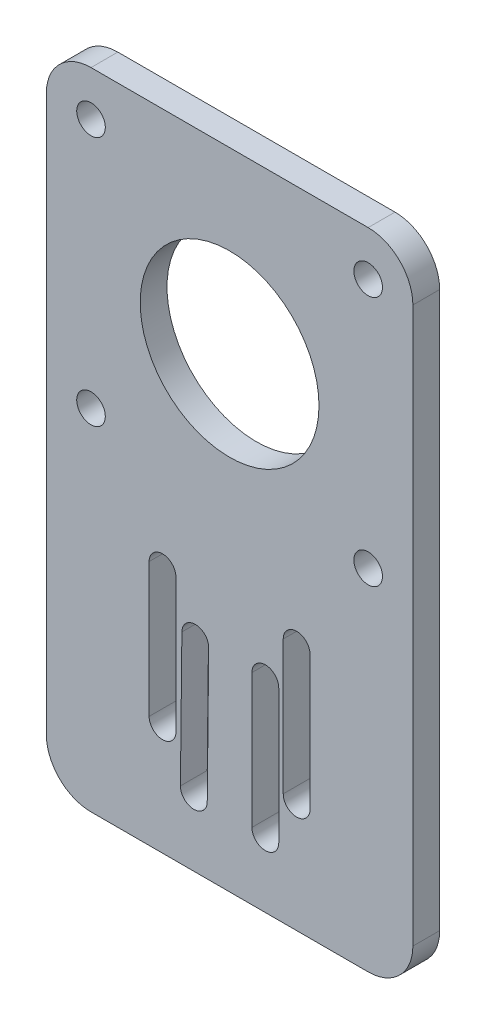
ISO-10303-21;
HEADER;
FILE_DESCRIPTION(('STEP AP214'),'2;1');
FILE_NAME('part.step','',(''),(''),'','','');
FILE_SCHEMA(('AUTOMOTIVE_DESIGN { 1 0 10303 214 1 1 1 1 }'));
ENDSEC;
DATA;
#1=APPLICATION_CONTEXT('core data for automotive mechanical design processes');
#2=APPLICATION_PROTOCOL_DEFINITION('international standard','automotive_design',2000,#1);
#3=PRODUCT_CONTEXT('',#1,'mechanical');
#4=PRODUCT('Part','Part','',(#3));
#5=PRODUCT_RELATED_PRODUCT_CATEGORY('part','',(#4));
#6=PRODUCT_DEFINITION_FORMATION('','',#4);
#7=PRODUCT_DEFINITION_CONTEXT('part definition',#1,'design');
#8=PRODUCT_DEFINITION('design','',#6,#7);
#9=PRODUCT_DEFINITION_SHAPE('','',#8);
#10=(LENGTH_UNIT() NAMED_UNIT(*) SI_UNIT(.MILLI.,.METRE.));
#11=(NAMED_UNIT(*) PLANE_ANGLE_UNIT() SI_UNIT($,.RADIAN.));
#12=(NAMED_UNIT(*) SI_UNIT($,.STERADIAN.) SOLID_ANGLE_UNIT());
#13=UNCERTAINTY_MEASURE_WITH_UNIT(LENGTH_MEASURE(1.E-05),#10,'distance_accuracy_value','');
#14=(GEOMETRIC_REPRESENTATION_CONTEXT(3) GLOBAL_UNCERTAINTY_ASSIGNED_CONTEXT((#13)) GLOBAL_UNIT_ASSIGNED_CONTEXT((#10,
#11,#12)) REPRESENTATION_CONTEXT('',''));
#15=CARTESIAN_POINT('',(0.,0.,0.));
#16=DIRECTION('',(0.,0.,1.));
#17=DIRECTION('',(1.,0.,0.));
#18=AXIS2_PLACEMENT_3D('',#15,#16,#17);
#19=CARTESIAN_POINT('',(559.100046396,830.,380.));
#20=DIRECTION('',(-1.,0.,0.));
#21=DIRECTION('',(0.,0.,1.));
#22=AXIS2_PLACEMENT_3D('',#19,#20,#21);
#23=PLANE('',#22);
#24=DIRECTION('',(0.,-1.,0.));
#25=VECTOR('',#24,1.);
#26=CARTESIAN_POINT('',(559.100046396,793.950476655,383.));
#27=LINE('',#26,#25);
#28=CARTESIAN_POINT('',(559.100046396,825.,383.));
#29=VERTEX_POINT('',#28);
#30=CARTESIAN_POINT('',(559.100046396,762.900953309,383.));
#31=VERTEX_POINT('',#30);
#32=EDGE_CURVE('E347',#29,#31,#27,.T.);
#33=ORIENTED_EDGE('',*,*,#32,.F.);
#34=DIRECTION('',(0.,0.,1.));
#35=VECTOR('',#34,1.);
#36=CARTESIAN_POINT('',(559.100046396,825.,381.5));
#37=LINE('',#36,#35);
#38=CARTESIAN_POINT('',(559.100046396,825.,380.));
#39=VERTEX_POINT('',#38);
#40=EDGE_CURVE('E296',#39,#29,#37,.T.);
#41=ORIENTED_EDGE('',*,*,#40,.F.);
#42=DIRECTION('',(0.,-1.,0.));
#43=VECTOR('',#42,1.);
#44=CARTESIAN_POINT('',(559.100046396,793.950476655,380.));
#45=LINE('',#44,#43);
#46=CARTESIAN_POINT('',(559.100046396,762.900953309,380.));
#47=VERTEX_POINT('',#46);
#48=EDGE_CURVE('E360',#39,#47,#45,.T.);
#49=ORIENTED_EDGE('',*,*,#48,.T.);
#50=DIRECTION('',(0.,0.,1.));
#51=VECTOR('',#50,1.);
#52=CARTESIAN_POINT('',(559.100046396,762.900953309,381.5));
#53=LINE('',#52,#51);
#54=EDGE_CURVE('E10',#47,#31,#53,.T.);
#55=ORIENTED_EDGE('',*,*,#54,.T.);
#56=EDGE_LOOP('',(#33,#41,#49,#55));
#57=FACE_BOUND('',#56,.T.);
#58=ADVANCED_FACE('F16',(#57),#23,.T.);
#59=CARTESIAN_POINT('',(564.100046396,762.900953309,381.5));
#60=DIRECTION('',(0.,0.,1.));
#61=DIRECTION('',(-1.,0.,0.));
#62=AXIS2_PLACEMENT_3D('',#59,#60,#61);
#63=CYLINDRICAL_SURFACE('',#62,5.);
#64=CARTESIAN_POINT('',(564.100046396,762.900953309,383.));
#65=DIRECTION('',(0.,0.,-1.));
#66=DIRECTION('',(1.,0.,0.));
#67=AXIS2_PLACEMENT_3D('',#64,#65,#66);
#68=CIRCLE('',#67,5.);
#69=CARTESIAN_POINT('',(564.100046396,757.900953309,383.));
#70=VERTEX_POINT('',#69);
#71=EDGE_CURVE('E334',#70,#31,#68,.T.);
#72=ORIENTED_EDGE('',*,*,#71,.T.);
#73=ORIENTED_EDGE('',*,*,#54,.F.);
#74=CARTESIAN_POINT('',(564.100046396,762.900953309,380.));
#75=DIRECTION('',(0.,0.,1.));
#76=DIRECTION('',(1.,0.,0.));
#77=AXIS2_PLACEMENT_3D('',#74,#75,#76);
#78=CIRCLE('',#77,5.);
#79=CARTESIAN_POINT('',(564.100046396,757.900953309,380.));
#80=VERTEX_POINT('',#79);
#81=EDGE_CURVE('E365',#47,#80,#78,.T.);
#82=ORIENTED_EDGE('',*,*,#81,.T.);
#83=DIRECTION('',(0.,0.,1.));
#84=VECTOR('',#83,1.);
#85=CARTESIAN_POINT('',(564.100046396,757.900953309,381.5));
#86=LINE('',#85,#84);
#87=EDGE_CURVE('E25',#80,#70,#86,.T.);
#88=ORIENTED_EDGE('',*,*,#87,.T.);
#89=EDGE_LOOP('',(#72,#73,#82,#88));
#90=FACE_BOUND('',#89,.T.);
#91=ADVANCED_FACE('F598',(#90),#63,.T.);
#92=CARTESIAN_POINT('',(600.100046396,757.900953309,380.));
#93=DIRECTION('',(0.,1.,0.));
#94=DIRECTION('',(0.,0.,-1.));
#95=AXIS2_PLACEMENT_3D('',#92,#93,#94);
#96=PLANE('',#95);
#97=ORIENTED_EDGE('',*,*,#87,.F.);
#98=DIRECTION('',(1.,0.,0.));
#99=VECTOR('',#98,1.);
#100=CARTESIAN_POINT('',(579.600046396,757.900953309,380.));
#101=LINE('',#100,#99);
#102=CARTESIAN_POINT('',(595.100046396,757.900953309,380.));
#103=VERTEX_POINT('',#102);
#104=EDGE_CURVE('E246',#80,#103,#101,.T.);
#105=ORIENTED_EDGE('',*,*,#104,.T.);
#106=DIRECTION('',(0.,0.,1.));
#107=VECTOR('',#106,1.);
#108=CARTESIAN_POINT('',(595.100046396,757.900953309,381.5));
#109=LINE('',#108,#107);
#110=CARTESIAN_POINT('',(595.100046396,757.900953309,383.));
#111=VERTEX_POINT('',#110);
#112=EDGE_CURVE('E19',#103,#111,#109,.T.);
#113=ORIENTED_EDGE('',*,*,#112,.T.);
#114=DIRECTION('',(1.,0.,0.));
#115=VECTOR('',#114,1.);
#116=CARTESIAN_POINT('',(579.600046396,757.900953309,383.));
#117=LINE('',#116,#115);
#118=EDGE_CURVE('E185',#70,#111,#117,.T.);
#119=ORIENTED_EDGE('',*,*,#118,.F.);
#120=EDGE_LOOP('',(#97,#105,#113,#119));
#121=FACE_BOUND('',#120,.T.);
#122=ADVANCED_FACE('F602',(#121),#96,.F.);
#123=CARTESIAN_POINT('',(595.100046396,762.900953309,381.5));
#124=DIRECTION('',(0.,0.,1.));
#125=DIRECTION('',(0.,-1.,0.));
#126=AXIS2_PLACEMENT_3D('',#123,#124,#125);
#127=CYLINDRICAL_SURFACE('',#126,5.);
#128=CARTESIAN_POINT('',(595.100046396,762.900953309,383.));
#129=DIRECTION('',(0.,0.,-1.));
#130=DIRECTION('',(1.,0.,0.));
#131=AXIS2_PLACEMENT_3D('',#128,#129,#130);
#132=CIRCLE('',#131,5.);
#133=CARTESIAN_POINT('',(600.100046396,762.900953309,383.));
#134=VERTEX_POINT('',#133);
#135=EDGE_CURVE('E328',#134,#111,#132,.T.);
#136=ORIENTED_EDGE('',*,*,#135,.T.);
#137=ORIENTED_EDGE('',*,*,#112,.F.);
#138=CARTESIAN_POINT('',(595.100046396,762.900953309,380.));
#139=DIRECTION('',(0.,0.,1.));
#140=DIRECTION('',(1.,0.,0.));
#141=AXIS2_PLACEMENT_3D('',#138,#139,#140);
#142=CIRCLE('',#141,5.);
#143=CARTESIAN_POINT('',(600.100046396,762.900953309,380.));
#144=VERTEX_POINT('',#143);
#145=EDGE_CURVE('E250',#103,#144,#142,.T.);
#146=ORIENTED_EDGE('',*,*,#145,.T.);
#147=DIRECTION('',(0.,0.,1.));
#148=VECTOR('',#147,1.);
#149=CARTESIAN_POINT('',(600.100046396,762.900953309,381.5));
#150=LINE('',#149,#148);
#151=EDGE_CURVE('E50',#144,#134,#150,.T.);
#152=ORIENTED_EDGE('',*,*,#151,.T.);
#153=EDGE_LOOP('',(#136,#137,#146,#152));
#154=FACE_BOUND('',#153,.T.);
#155=ADVANCED_FACE('F607',(#154),#127,.T.);
#156=CARTESIAN_POINT('',(600.100046396,757.900953309,380.));
#157=DIRECTION('',(1.,0.,0.));
#158=DIRECTION('',(0.,0.,1.));
#159=AXIS2_PLACEMENT_3D('',#156,#157,#158);
#160=PLANE('',#159);
#161=DIRECTION('',(0.,1.,0.));
#162=VECTOR('',#161,1.);
#163=CARTESIAN_POINT('',(600.100046396,793.950476655,383.));
#164=LINE('',#163,#162);
#165=CARTESIAN_POINT('',(600.100046396,825.,383.));
#166=VERTEX_POINT('',#165);
#167=EDGE_CURVE('E337',#134,#166,#164,.T.);
#168=ORIENTED_EDGE('',*,*,#167,.F.);
#169=ORIENTED_EDGE('',*,*,#151,.F.);
#170=DIRECTION('',(0.,1.,0.));
#171=VECTOR('',#170,1.);
#172=CARTESIAN_POINT('',(600.100046396,793.950476655,380.));
#173=LINE('',#172,#171);
#174=CARTESIAN_POINT('',(600.100046396,825.,380.));
#175=VERTEX_POINT('',#174);
#176=EDGE_CURVE('E303',#144,#175,#173,.T.);
#177=ORIENTED_EDGE('',*,*,#176,.T.);
#178=DIRECTION('',(0.,0.,1.));
#179=VECTOR('',#178,1.);
#180=CARTESIAN_POINT('',(600.100046396,825.,381.5));
#181=LINE('',#180,#179);
#182=EDGE_CURVE('E293',#175,#166,#181,.T.);
#183=ORIENTED_EDGE('',*,*,#182,.T.);
#184=EDGE_LOOP('',(#168,#169,#177,#183));
#185=FACE_BOUND('',#184,.T.);
#186=ADVANCED_FACE('F613',(#185),#160,.T.);
#187=CARTESIAN_POINT('',(564.100046396,825.,381.5));
#188=DIRECTION('',(0.,0.,1.));
#189=DIRECTION('',(0.,1.,0.));
#190=AXIS2_PLACEMENT_3D('',#187,#188,#189);
#191=CYLINDRICAL_SURFACE('',#190,5.);
#192=CARTESIAN_POINT('',(564.100046396,825.,383.));
#193=DIRECTION('',(0.,0.,-1.));
#194=DIRECTION('',(1.,0.,0.));
#195=AXIS2_PLACEMENT_3D('',#192,#193,#194);
#196=CIRCLE('',#195,5.);
#197=CARTESIAN_POINT('',(564.100046396,830.,383.));
#198=VERTEX_POINT('',#197);
#199=EDGE_CURVE('E259',#29,#198,#196,.T.);
#200=ORIENTED_EDGE('',*,*,#199,.T.);
#201=DIRECTION('',(0.,0.,1.));
#202=VECTOR('',#201,1.);
#203=CARTESIAN_POINT('',(564.100046396,830.,381.5));
#204=LINE('',#203,#202);
#205=CARTESIAN_POINT('',(564.100046396,830.,380.));
#206=VERTEX_POINT('',#205);
#207=EDGE_CURVE('E120',#206,#198,#204,.T.);
#208=ORIENTED_EDGE('',*,*,#207,.F.);
#209=CARTESIAN_POINT('',(564.100046396,825.,380.));
#210=DIRECTION('',(0.,0.,1.));
#211=DIRECTION('',(1.,0.,0.));
#212=AXIS2_PLACEMENT_3D('',#209,#210,#211);
#213=CIRCLE('',#212,5.);
#214=EDGE_CURVE('E356',#206,#39,#213,.T.);
#215=ORIENTED_EDGE('',*,*,#214,.T.);
#216=ORIENTED_EDGE('',*,*,#40,.T.);
#217=EDGE_LOOP('',(#200,#208,#215,#216));
#218=FACE_BOUND('',#217,.T.);
#219=ADVANCED_FACE('F403',(#218),#191,.T.);
#220=CARTESIAN_POINT('',(595.100046396,825.,381.5));
#221=DIRECTION('',(0.,0.,1.));
#222=DIRECTION('',(1.,0.,0.));
#223=AXIS2_PLACEMENT_3D('',#220,#221,#222);
#224=CYLINDRICAL_SURFACE('',#223,5.);
#225=CARTESIAN_POINT('',(595.100046396,825.,383.));
#226=DIRECTION('',(0.,0.,-1.));
#227=DIRECTION('',(1.,0.,0.));
#228=AXIS2_PLACEMENT_3D('',#225,#226,#227);
#229=CIRCLE('',#228,5.);
#230=CARTESIAN_POINT('',(595.100046396,830.,383.));
#231=VERTEX_POINT('',#230);
#232=EDGE_CURVE('E260',#231,#166,#229,.T.);
#233=ORIENTED_EDGE('',*,*,#232,.T.);
#234=ORIENTED_EDGE('',*,*,#182,.F.);
#235=CARTESIAN_POINT('',(595.100046396,825.,380.));
#236=DIRECTION('',(0.,0.,1.));
#237=DIRECTION('',(1.,0.,0.));
#238=AXIS2_PLACEMENT_3D('',#235,#236,#237);
#239=CIRCLE('',#238,5.);
#240=CARTESIAN_POINT('',(595.100046396,830.,380.));
#241=VERTEX_POINT('',#240);
#242=EDGE_CURVE('E372',#175,#241,#239,.T.);
#243=ORIENTED_EDGE('',*,*,#242,.T.);
#244=DIRECTION('',(0.,0.,1.));
#245=VECTOR('',#244,1.);
#246=CARTESIAN_POINT('',(595.100046396,830.,381.5));
#247=LINE('',#246,#245);
#248=EDGE_CURVE('E109',#241,#231,#247,.T.);
#249=ORIENTED_EDGE('',*,*,#248,.T.);
#250=EDGE_LOOP('',(#233,#234,#243,#249));
#251=FACE_BOUND('',#250,.T.);
#252=ADVANCED_FACE('F620',(#251),#224,.T.);
#253=CARTESIAN_POINT('',(559.100046396,830.,380.));
#254=DIRECTION('',(0.,-1.,0.));
#255=DIRECTION('',(0.,0.,-1.));
#256=AXIS2_PLACEMENT_3D('',#253,#254,#255);
#257=PLANE('',#256);
#258=ORIENTED_EDGE('',*,*,#207,.T.);
#259=DIRECTION('',(-1.,0.,0.));
#260=VECTOR('',#259,1.);
#261=CARTESIAN_POINT('',(579.600046396,830.,383.));
#262=LINE('',#261,#260);
#263=EDGE_CURVE('E255',#231,#198,#262,.T.);
#264=ORIENTED_EDGE('',*,*,#263,.F.);
#265=ORIENTED_EDGE('',*,*,#248,.F.);
#266=DIRECTION('',(-1.,0.,0.));
#267=VECTOR('',#266,1.);
#268=CARTESIAN_POINT('',(579.600046396,830.,380.));
#269=LINE('',#268,#267);
#270=EDGE_CURVE('E359',#241,#206,#269,.T.);
#271=ORIENTED_EDGE('',*,*,#270,.T.);
#272=EDGE_LOOP('',(#258,#264,#265,#271));
#273=FACE_BOUND('',#272,.T.);
#274=ADVANCED_FACE('F616',(#273),#257,.F.);
#275=CARTESIAN_POINT('',(579.600046396,810.,381.5));
#276=DIRECTION('',(0.,0.,1.));
#277=DIRECTION('',(1.,0.,0.));
#278=AXIS2_PLACEMENT_3D('',#275,#276,#277);
#279=CYLINDRICAL_SURFACE('',#278,10.);
#280=CARTESIAN_POINT('',(579.600046396,810.,383.));
#281=DIRECTION('',(0.,0.,1.));
#282=DIRECTION('',(1.,0.,0.));
#283=AXIS2_PLACEMENT_3D('',#280,#281,#282);
#284=CIRCLE('',#283,10.);
#285=CARTESIAN_POINT('',(589.600046396,810.,383.));
#286=VERTEX_POINT('',#285);
#287=EDGE_CURVE('E329',#286,#286,#284,.T.);
#288=ORIENTED_EDGE('',*,*,#287,.T.);
#289=EDGE_LOOP('',(#288));
#290=FACE_BOUND('',#289,.T.);
#291=CARTESIAN_POINT('',(579.600046396,810.,380.));
#292=DIRECTION('',(0.,0.,1.));
#293=DIRECTION('',(1.,0.,0.));
#294=AXIS2_PLACEMENT_3D('',#291,#292,#293);
#295=CIRCLE('',#294,10.);
#296=CARTESIAN_POINT('',(589.600046396,810.,380.));
#297=VERTEX_POINT('',#296);
#298=EDGE_CURVE('E249',#297,#297,#295,.T.);
#299=ORIENTED_EDGE('',*,*,#298,.F.);
#300=EDGE_LOOP('',(#299));
#301=FACE_BOUND('',#300,.T.);
#302=ADVANCED_FACE('F619',(#290,#301),#279,.F.);
#303=CARTESIAN_POINT('',(595.100046396,797.,381.5));
#304=DIRECTION('',(0.,0.,1.));
#305=DIRECTION('',(1.,0.,0.));
#306=AXIS2_PLACEMENT_3D('',#303,#304,#305);
#307=CYLINDRICAL_SURFACE('',#306,1.59999999987);
#308=CARTESIAN_POINT('',(595.100046396,797.,383.));
#309=DIRECTION('',(0.,0.,1.));
#310=DIRECTION('',(1.,0.,0.));
#311=AXIS2_PLACEMENT_3D('',#308,#309,#310);
#312=CIRCLE('',#311,1.59999999987);
#313=CARTESIAN_POINT('',(596.70004639587,797.,383.));
#314=VERTEX_POINT('',#313);
#315=EDGE_CURVE('E333',#314,#314,#312,.T.);
#316=ORIENTED_EDGE('',*,*,#315,.T.);
#317=EDGE_LOOP('',(#316));
#318=FACE_BOUND('',#317,.T.);
#319=CARTESIAN_POINT('',(595.100046396,797.,380.));
#320=DIRECTION('',(0.,0.,1.));
#321=DIRECTION('',(1.,0.,0.));
#322=AXIS2_PLACEMENT_3D('',#319,#320,#321);
#323=CIRCLE('',#322,1.59999999987);
#324=CARTESIAN_POINT('',(596.70004639587,797.,380.));
#325=VERTEX_POINT('',#324);
#326=EDGE_CURVE('E380',#325,#325,#323,.T.);
#327=ORIENTED_EDGE('',*,*,#326,.F.);
#328=EDGE_LOOP('',(#327));
#329=FACE_BOUND('',#328,.T.);
#330=ADVANCED_FACE('F623',(#318,#329),#307,.F.);
#331=CARTESIAN_POINT('',(564.100046396,797.,381.5));
#332=DIRECTION('',(0.,0.,1.));
#333=DIRECTION('',(1.,0.,0.));
#334=AXIS2_PLACEMENT_3D('',#331,#332,#333);
#335=CYLINDRICAL_SURFACE('',#334,1.59999999984);
#336=CARTESIAN_POINT('',(564.100046396,797.,383.));
#337=DIRECTION('',(0.,0.,1.));
#338=DIRECTION('',(1.,0.,0.));
#339=AXIS2_PLACEMENT_3D('',#336,#337,#338);
#340=CIRCLE('',#339,1.59999999984);
#341=CARTESIAN_POINT('',(565.70004639584,797.,383.));
#342=VERTEX_POINT('',#341);
#343=EDGE_CURVE('E351',#342,#342,#340,.T.);
#344=ORIENTED_EDGE('',*,*,#343,.T.);
#345=EDGE_LOOP('',(#344));
#346=FACE_BOUND('',#345,.T.);
#347=CARTESIAN_POINT('',(564.100046396,797.,380.));
#348=DIRECTION('',(0.,0.,1.));
#349=DIRECTION('',(1.,0.,0.));
#350=AXIS2_PLACEMENT_3D('',#347,#348,#349);
#351=CIRCLE('',#350,1.59999999984);
#352=CARTESIAN_POINT('',(565.70004639584,797.,380.));
#353=VERTEX_POINT('',#352);
#354=EDGE_CURVE('E384',#353,#353,#351,.T.);
#355=ORIENTED_EDGE('',*,*,#354,.F.);
#356=EDGE_LOOP('',(#355));
#357=FACE_BOUND('',#356,.T.);
#358=ADVANCED_FACE('F627',(#346,#357),#335,.F.);
#359=CARTESIAN_POINT('',(564.100046396,825.,381.5));
#360=DIRECTION('',(0.,0.,1.));
#361=DIRECTION('',(1.,0.,0.));
#362=AXIS2_PLACEMENT_3D('',#359,#360,#361);
#363=CYLINDRICAL_SURFACE('',#362,1.59999999984);
#364=CARTESIAN_POINT('',(564.100046396,825.,383.));
#365=DIRECTION('',(0.,0.,1.));
#366=DIRECTION('',(1.,0.,0.));
#367=AXIS2_PLACEMENT_3D('',#364,#365,#366);
#368=CIRCLE('',#367,1.59999999984);
#369=CARTESIAN_POINT('',(565.70004639584,825.,383.));
#370=VERTEX_POINT('',#369);
#371=EDGE_CURVE('E355',#370,#370,#368,.T.);
#372=ORIENTED_EDGE('',*,*,#371,.T.);
#373=EDGE_LOOP('',(#372));
#374=FACE_BOUND('',#373,.T.);
#375=CARTESIAN_POINT('',(564.100046396,825.,380.));
#376=DIRECTION('',(0.,0.,1.));
#377=DIRECTION('',(1.,0.,0.));
#378=AXIS2_PLACEMENT_3D('',#375,#376,#377);
#379=CIRCLE('',#378,1.59999999984);
#380=CARTESIAN_POINT('',(565.70004639584,825.,380.));
#381=VERTEX_POINT('',#380);
#382=EDGE_CURVE('E388',#381,#381,#379,.T.);
#383=ORIENTED_EDGE('',*,*,#382,.F.);
#384=EDGE_LOOP('',(#383));
#385=FACE_BOUND('',#384,.T.);
#386=ADVANCED_FACE('F631',(#374,#385),#363,.F.);
#387=CARTESIAN_POINT('',(595.100046396,825.,381.5));
#388=DIRECTION('',(0.,0.,1.));
#389=DIRECTION('',(1.,0.,0.));
#390=AXIS2_PLACEMENT_3D('',#387,#388,#389);
#391=CYLINDRICAL_SURFACE('',#390,1.59999999994);
#392=CARTESIAN_POINT('',(595.100046396,825.,383.));
#393=DIRECTION('',(0.,0.,1.));
#394=DIRECTION('',(1.,0.,0.));
#395=AXIS2_PLACEMENT_3D('',#392,#393,#394);
#396=CIRCLE('',#395,1.59999999994);
#397=CARTESIAN_POINT('',(596.70004639594,825.,383.));
#398=VERTEX_POINT('',#397);
#399=EDGE_CURVE('E361',#398,#398,#396,.T.);
#400=ORIENTED_EDGE('',*,*,#399,.T.);
#401=EDGE_LOOP('',(#400));
#402=FACE_BOUND('',#401,.T.);
#403=CARTESIAN_POINT('',(595.100046396,825.,380.));
#404=DIRECTION('',(0.,0.,1.));
#405=DIRECTION('',(1.,0.,0.));
#406=AXIS2_PLACEMENT_3D('',#403,#404,#405);
#407=CIRCLE('',#406,1.59999999994);
#408=CARTESIAN_POINT('',(596.70004639594,825.,380.));
#409=VERTEX_POINT('',#408);
#410=EDGE_CURVE('E394',#409,#409,#407,.T.);
#411=ORIENTED_EDGE('',*,*,#410,.F.);
#412=EDGE_LOOP('',(#411));
#413=FACE_BOUND('',#412,.T.);
#414=ADVANCED_FACE('F633',(#402,#413),#391,.F.);
#415=CARTESIAN_POINT('',(0.,0.,380.));
#416=DIRECTION('',(0.,0.,1.));
#417=DIRECTION('',(0.,-1.,0.));
#418=AXIS2_PLACEMENT_3D('',#415,#416,#417);
#419=PLANE('',#418);
#420=DIRECTION('',(0.,-1.,0.));
#421=VECTOR('',#420,1.);
#422=CARTESIAN_POINT('',(585.600046396,777.900953309,380.));
#423=LINE('',#422,#421);
#424=CARTESIAN_POINT('',(585.600046396,785.400953309,380.));
#425=VERTEX_POINT('',#424);
#426=CARTESIAN_POINT('',(585.600046396,770.400953309,380.));
#427=VERTEX_POINT('',#426);
#428=EDGE_CURVE('E180',#425,#427,#423,.T.);
#429=ORIENTED_EDGE('',*,*,#428,.T.);
#430=CARTESIAN_POINT('',(587.100046396,770.400953309,380.));
#431=DIRECTION('',(0.,0.,1.));
#432=DIRECTION('',(1.,0.,0.));
#433=AXIS2_PLACEMENT_3D('',#430,#431,#432);
#434=CIRCLE('',#433,1.5);
#435=CARTESIAN_POINT('',(588.600046396,770.400953309,380.));
#436=VERTEX_POINT('',#435);
#437=EDGE_CURVE('E313',#427,#436,#434,.T.);
#438=ORIENTED_EDGE('',*,*,#437,.T.);
#439=DIRECTION('',(0.,1.,0.));
#440=VECTOR('',#439,1.);
#441=CARTESIAN_POINT('',(588.600046396,777.900953309,380.));
#442=LINE('',#441,#440);
#443=CARTESIAN_POINT('',(588.600046396,785.400953309,380.));
#444=VERTEX_POINT('',#443);
#445=EDGE_CURVE('E182',#436,#444,#442,.T.);
#446=ORIENTED_EDGE('',*,*,#445,.T.);
#447=CARTESIAN_POINT('',(587.100046396,785.400953309,380.));
#448=DIRECTION('',(0.,0.,1.));
#449=DIRECTION('',(1.,0.,0.));
#450=AXIS2_PLACEMENT_3D('',#447,#448,#449);
#451=CIRCLE('',#450,1.5);
#452=EDGE_CURVE('E175',#444,#425,#451,.T.);
#453=ORIENTED_EDGE('',*,*,#452,.T.);
#454=EDGE_LOOP('',(#429,#438,#446,#453));
#455=FACE_BOUND('',#454,.T.);
#456=DIRECTION('',(0.,1.,0.));
#457=VECTOR('',#456,1.);
#458=CARTESIAN_POINT('',(585.100046396,772.900953309,380.));
#459=LINE('',#458,#457);
#460=CARTESIAN_POINT('',(585.100046396,765.400953309,380.));
#461=VERTEX_POINT('',#460);
#462=CARTESIAN_POINT('',(585.100046396,780.400953309,380.));
#463=VERTEX_POINT('',#462);
#464=EDGE_CURVE('E230',#461,#463,#459,.T.);
#465=ORIENTED_EDGE('',*,*,#464,.T.);
#466=CARTESIAN_POINT('',(583.600046396,780.400953309,380.));
#467=DIRECTION('',(0.,0.,1.));
#468=DIRECTION('',(1.,0.,0.));
#469=AXIS2_PLACEMENT_3D('',#466,#467,#468);
#470=CIRCLE('',#469,1.5);
#471=CARTESIAN_POINT('',(582.100046396,780.400953309,380.));
#472=VERTEX_POINT('',#471);
#473=EDGE_CURVE('E220',#463,#472,#470,.T.);
#474=ORIENTED_EDGE('',*,*,#473,.T.);
#475=DIRECTION('',(0.,-1.,0.));
#476=VECTOR('',#475,1.);
#477=CARTESIAN_POINT('',(582.100046396,772.900953309,380.));
#478=LINE('',#477,#476);
#479=CARTESIAN_POINT('',(582.100046396,765.400953309,380.));
#480=VERTEX_POINT('',#479);
#481=EDGE_CURVE('E292',#472,#480,#478,.T.);
#482=ORIENTED_EDGE('',*,*,#481,.T.);
#483=CARTESIAN_POINT('',(583.600046396,765.400953309,380.));
#484=DIRECTION('',(0.,0.,1.));
#485=DIRECTION('',(1.,0.,0.));
#486=AXIS2_PLACEMENT_3D('',#483,#484,#485);
#487=CIRCLE('',#486,1.5);
#488=EDGE_CURVE('E309',#480,#461,#487,.T.);
#489=ORIENTED_EDGE('',*,*,#488,.T.);
#490=EDGE_LOOP('',(#465,#474,#482,#489));
#491=FACE_BOUND('',#490,.T.);
#492=DIRECTION('',(-0.0109878593111968,-0.99993963165171,0.));
#493=VECTOR('',#492,1.);
#494=CARTESIAN_POINT('',(574.182545894,772.916982336,380.));
#495=LINE('',#494,#493);
#496=CARTESIAN_POINT('',(574.264954838,780.416529573,380.));
#497=VERTEX_POINT('',#496);
#498=CARTESIAN_POINT('',(574.100136949,765.417435098,380.));
#499=VERTEX_POINT('',#498);
#500=EDGE_CURVE('E214',#497,#499,#495,.T.);
#501=ORIENTED_EDGE('',*,*,#500,.T.);
#502=CARTESIAN_POINT('',(575.600046396,765.400953309,380.));
#503=DIRECTION('',(0.,0.,1.));
#504=DIRECTION('',(1.,0.,0.));
#505=AXIS2_PLACEMENT_3D('',#502,#503,#504);
#506=CIRCLE('',#505,1.5);
#507=CARTESIAN_POINT('',(577.099955844,765.38447152,380.));
#508=VERTEX_POINT('',#507);
#509=EDGE_CURVE('E468',#499,#508,#506,.T.);
#510=ORIENTED_EDGE('',*,*,#509,.T.);
#511=DIRECTION('',(0.0109878593111968,0.99993963165171,0.));
#512=VECTOR('',#511,1.);
#513=CARTESIAN_POINT('',(577.182364789,772.884018758,380.));
#514=LINE('',#513,#512);
#515=CARTESIAN_POINT('',(577.264773733,780.383565995,380.));
#516=VERTEX_POINT('',#515);
#517=EDGE_CURVE('E245',#508,#516,#514,.T.);
#518=ORIENTED_EDGE('',*,*,#517,.T.);
#519=CARTESIAN_POINT('',(575.764864286,780.400047784,380.));
#520=DIRECTION('',(0.,0.,1.));
#521=DIRECTION('',(1.,0.,0.));
#522=AXIS2_PLACEMENT_3D('',#519,#520,#521);
#523=CIRCLE('',#522,1.5);
#524=EDGE_CURVE('E264',#516,#497,#523,.T.);
#525=ORIENTED_EDGE('',*,*,#524,.T.);
#526=EDGE_LOOP('',(#501,#510,#518,#525));
#527=FACE_BOUND('',#526,.T.);
#528=DIRECTION('',(0.,1.,0.));
#529=VECTOR('',#528,1.);
#530=CARTESIAN_POINT('',(573.600046396,777.900953309,380.));
#531=LINE('',#530,#529);
#532=CARTESIAN_POINT('',(573.600046396,770.400953309,380.));
#533=VERTEX_POINT('',#532);
#534=CARTESIAN_POINT('',(573.600046396,785.400953309,380.));
#535=VERTEX_POINT('',#534);
#536=EDGE_CURVE('E477',#533,#535,#531,.T.);
#537=ORIENTED_EDGE('',*,*,#536,.T.);
#538=CARTESIAN_POINT('',(572.100046396,785.400953309,380.));
#539=DIRECTION('',(0.,0.,1.));
#540=DIRECTION('',(1.,0.,0.));
#541=AXIS2_PLACEMENT_3D('',#538,#539,#540);
#542=CIRCLE('',#541,1.5);
#543=CARTESIAN_POINT('',(570.600046396,785.400953309,380.));
#544=VERTEX_POINT('',#543);
#545=EDGE_CURVE('E464',#535,#544,#542,.T.);
#546=ORIENTED_EDGE('',*,*,#545,.T.);
#547=DIRECTION('',(0.,-1.,0.));
#548=VECTOR('',#547,1.);
#549=CARTESIAN_POINT('',(570.600046396,777.900953309,380.));
#550=LINE('',#549,#548);
#551=CARTESIAN_POINT('',(570.600046396,770.400953309,380.));
#552=VERTEX_POINT('',#551);
#553=EDGE_CURVE('E428',#544,#552,#550,.T.);
#554=ORIENTED_EDGE('',*,*,#553,.T.);
#555=CARTESIAN_POINT('',(572.100046396,770.400953309,380.));
#556=DIRECTION('',(0.,0.,1.));
#557=DIRECTION('',(1.,0.,0.));
#558=AXIS2_PLACEMENT_3D('',#555,#556,#557);
#559=CIRCLE('',#558,1.5);
#560=EDGE_CURVE('E430',#552,#533,#559,.T.);
#561=ORIENTED_EDGE('',*,*,#560,.T.);
#562=EDGE_LOOP('',(#537,#546,#554,#561));
#563=FACE_BOUND('',#562,.T.);
#564=ORIENTED_EDGE('',*,*,#410,.T.);
#565=EDGE_LOOP('',(#564));
#566=FACE_BOUND('',#565,.T.);
#567=ORIENTED_EDGE('',*,*,#382,.T.);
#568=EDGE_LOOP('',(#567));
#569=FACE_BOUND('',#568,.T.);
#570=ORIENTED_EDGE('',*,*,#354,.T.);
#571=EDGE_LOOP('',(#570));
#572=FACE_BOUND('',#571,.T.);
#573=ORIENTED_EDGE('',*,*,#326,.T.);
#574=EDGE_LOOP('',(#573));
#575=FACE_BOUND('',#574,.T.);
#576=ORIENTED_EDGE('',*,*,#298,.T.);
#577=EDGE_LOOP('',(#576));
#578=FACE_BOUND('',#577,.T.);
#579=ORIENTED_EDGE('',*,*,#81,.F.);
#580=ORIENTED_EDGE('',*,*,#48,.F.);
#581=ORIENTED_EDGE('',*,*,#214,.F.);
#582=ORIENTED_EDGE('',*,*,#270,.F.);
#583=ORIENTED_EDGE('',*,*,#242,.F.);
#584=ORIENTED_EDGE('',*,*,#176,.F.);
#585=ORIENTED_EDGE('',*,*,#145,.F.);
#586=ORIENTED_EDGE('',*,*,#104,.F.);
#587=EDGE_LOOP('',(#579,#580,#581,#582,#583,#584,#585,#586));
#588=FACE_BOUND('',#587,.T.);
#589=ADVANCED_FACE('F176',(#455,#491,#527,#563,#566,#569,#572,#575,#578,#588),#419,.F.);
#590=CARTESIAN_POINT('',(0.,0.,383.));
#591=DIRECTION('',(0.,0.,1.));
#592=DIRECTION('',(0.,-1.,0.));
#593=AXIS2_PLACEMENT_3D('',#590,#591,#592);
#594=PLANE('',#593);
#595=CARTESIAN_POINT('',(587.100046396,785.400953309,383.));
#596=DIRECTION('',(0.,0.,1.));
#597=DIRECTION('',(1.,0.,0.));
#598=AXIS2_PLACEMENT_3D('',#595,#596,#597);
#599=CIRCLE('',#598,1.5);
#600=CARTESIAN_POINT('',(588.600046396,785.400953309,383.));
#601=VERTEX_POINT('',#600);
#602=CARTESIAN_POINT('',(585.600046396,785.400953309,383.));
#603=VERTEX_POINT('',#602);
#604=EDGE_CURVE('E169',#601,#603,#599,.T.);
#605=ORIENTED_EDGE('',*,*,#604,.F.);
#606=DIRECTION('',(0.,1.,0.));
#607=VECTOR('',#606,1.);
#608=CARTESIAN_POINT('',(588.600046396,777.900953309,383.));
#609=LINE('',#608,#607);
#610=CARTESIAN_POINT('',(588.600046396,770.400953309,383.));
#611=VERTEX_POINT('',#610);
#612=EDGE_CURVE('E192',#611,#601,#609,.T.);
#613=ORIENTED_EDGE('',*,*,#612,.F.);
#614=CARTESIAN_POINT('',(587.100046396,770.400953309,383.));
#615=DIRECTION('',(0.,0.,1.));
#616=DIRECTION('',(1.,0.,0.));
#617=AXIS2_PLACEMENT_3D('',#614,#615,#616);
#618=CIRCLE('',#617,1.5);
#619=CARTESIAN_POINT('',(585.600046396,770.400953309,383.));
#620=VERTEX_POINT('',#619);
#621=EDGE_CURVE('E304',#620,#611,#618,.T.);
#622=ORIENTED_EDGE('',*,*,#621,.F.);
#623=DIRECTION('',(0.,-1.,0.));
#624=VECTOR('',#623,1.);
#625=CARTESIAN_POINT('',(585.600046396,777.900953309,383.));
#626=LINE('',#625,#624);
#627=EDGE_CURVE('E199',#603,#620,#626,.T.);
#628=ORIENTED_EDGE('',*,*,#627,.F.);
#629=EDGE_LOOP('',(#605,#613,#622,#628));
#630=FACE_BOUND('',#629,.T.);
#631=CARTESIAN_POINT('',(583.600046396,765.400953309,383.));
#632=DIRECTION('',(0.,0.,1.));
#633=DIRECTION('',(1.,0.,0.));
#634=AXIS2_PLACEMENT_3D('',#631,#632,#633);
#635=CIRCLE('',#634,1.5);
#636=CARTESIAN_POINT('',(582.100046396,765.400953309,383.));
#637=VERTEX_POINT('',#636);
#638=CARTESIAN_POINT('',(585.100046396,765.400953309,383.));
#639=VERTEX_POINT('',#638);
#640=EDGE_CURVE('E300',#637,#639,#635,.T.);
#641=ORIENTED_EDGE('',*,*,#640,.F.);
#642=DIRECTION('',(0.,-1.,0.));
#643=VECTOR('',#642,1.);
#644=CARTESIAN_POINT('',(582.100046396,772.900953309,383.));
#645=LINE('',#644,#643);
#646=CARTESIAN_POINT('',(582.100046396,780.400953309,383.));
#647=VERTEX_POINT('',#646);
#648=EDGE_CURVE('E284',#647,#637,#645,.T.);
#649=ORIENTED_EDGE('',*,*,#648,.F.);
#650=CARTESIAN_POINT('',(583.600046396,780.400953309,383.));
#651=DIRECTION('',(0.,0.,1.));
#652=DIRECTION('',(1.,0.,0.));
#653=AXIS2_PLACEMENT_3D('',#650,#651,#652);
#654=CIRCLE('',#653,1.5);
#655=CARTESIAN_POINT('',(585.100046396,780.400953309,383.));
#656=VERTEX_POINT('',#655);
#657=EDGE_CURVE('E268',#656,#647,#654,.T.);
#658=ORIENTED_EDGE('',*,*,#657,.F.);
#659=DIRECTION('',(0.,1.,0.));
#660=VECTOR('',#659,1.);
#661=CARTESIAN_POINT('',(585.100046396,772.900953309,383.));
#662=LINE('',#661,#660);
#663=EDGE_CURVE('E234',#639,#656,#662,.T.);
#664=ORIENTED_EDGE('',*,*,#663,.F.);
#665=EDGE_LOOP('',(#641,#649,#658,#664));
#666=FACE_BOUND('',#665,.T.);
#667=CARTESIAN_POINT('',(575.764864286,780.400047784,383.));
#668=DIRECTION('',(0.,0.,1.));
#669=DIRECTION('',(1.,0.,0.));
#670=AXIS2_PLACEMENT_3D('',#667,#668,#669);
#671=CIRCLE('',#670,1.5);
#672=CARTESIAN_POINT('',(577.264773733,780.383565995,383.));
#673=VERTEX_POINT('',#672);
#674=CARTESIAN_POINT('',(574.264954838,780.416529573,383.));
#675=VERTEX_POINT('',#674);
#676=EDGE_CURVE('E254',#673,#675,#671,.T.);
#677=ORIENTED_EDGE('',*,*,#676,.F.);
#678=DIRECTION('',(0.0109878593111968,0.99993963165171,0.));
#679=VECTOR('',#678,1.);
#680=CARTESIAN_POINT('',(577.182364789,772.884018758,383.));
#681=LINE('',#680,#679);
#682=CARTESIAN_POINT('',(577.099955844,765.38447152,383.));
#683=VERTEX_POINT('',#682);
#684=EDGE_CURVE('E229',#683,#673,#681,.T.);
#685=ORIENTED_EDGE('',*,*,#684,.F.);
#686=CARTESIAN_POINT('',(575.600046396,765.400953309,383.));
#687=DIRECTION('',(0.,0.,1.));
#688=DIRECTION('',(1.,0.,0.));
#689=AXIS2_PLACEMENT_3D('',#686,#687,#688);
#690=CIRCLE('',#689,1.5);
#691=CARTESIAN_POINT('',(574.100136949,765.417435098,383.));
#692=VERTEX_POINT('',#691);
#693=EDGE_CURVE('E434',#692,#683,#690,.T.);
#694=ORIENTED_EDGE('',*,*,#693,.F.);
#695=DIRECTION('',(-0.0109878593111968,-0.99993963165171,0.));
#696=VECTOR('',#695,1.);
#697=CARTESIAN_POINT('',(574.182545894,772.916982336,383.));
#698=LINE('',#697,#696);
#699=EDGE_CURVE('E210',#675,#692,#698,.T.);
#700=ORIENTED_EDGE('',*,*,#699,.F.);
#701=EDGE_LOOP('',(#677,#685,#694,#700));
#702=FACE_BOUND('',#701,.T.);
#703=CARTESIAN_POINT('',(572.100046396,770.400953309,383.));
#704=DIRECTION('',(0.,0.,1.));
#705=DIRECTION('',(1.,0.,0.));
#706=AXIS2_PLACEMENT_3D('',#703,#704,#705);
#707=CIRCLE('',#706,1.5);
#708=CARTESIAN_POINT('',(570.600046396,770.400953309,383.));
#709=VERTEX_POINT('',#708);
#710=CARTESIAN_POINT('',(573.600046396,770.400953309,383.));
#711=VERTEX_POINT('',#710);
#712=EDGE_CURVE('E435',#709,#711,#707,.T.);
#713=ORIENTED_EDGE('',*,*,#712,.F.);
#714=DIRECTION('',(0.,-1.,0.));
#715=VECTOR('',#714,1.);
#716=CARTESIAN_POINT('',(570.600046396,777.900953309,383.));
#717=LINE('',#716,#715);
#718=CARTESIAN_POINT('',(570.600046396,785.400953309,383.));
#719=VERTEX_POINT('',#718);
#720=EDGE_CURVE('E429',#719,#709,#717,.T.);
#721=ORIENTED_EDGE('',*,*,#720,.F.);
#722=CARTESIAN_POINT('',(572.100046396,785.400953309,383.));
#723=DIRECTION('',(0.,0.,1.));
#724=DIRECTION('',(1.,0.,0.));
#725=AXIS2_PLACEMENT_3D('',#722,#723,#724);
#726=CIRCLE('',#725,1.5);
#727=CARTESIAN_POINT('',(573.600046396,785.400953309,383.));
#728=VERTEX_POINT('',#727);
#729=EDGE_CURVE('E508',#728,#719,#726,.T.);
#730=ORIENTED_EDGE('',*,*,#729,.F.);
#731=DIRECTION('',(0.,1.,0.));
#732=VECTOR('',#731,1.);
#733=CARTESIAN_POINT('',(573.600046396,777.900953309,383.));
#734=LINE('',#733,#732);
#735=EDGE_CURVE('E463',#711,#728,#734,.T.);
#736=ORIENTED_EDGE('',*,*,#735,.F.);
#737=EDGE_LOOP('',(#713,#721,#730,#736));
#738=FACE_BOUND('',#737,.T.);
#739=ORIENTED_EDGE('',*,*,#399,.F.);
#740=EDGE_LOOP('',(#739));
#741=FACE_BOUND('',#740,.T.);
#742=ORIENTED_EDGE('',*,*,#371,.F.);
#743=EDGE_LOOP('',(#742));
#744=FACE_BOUND('',#743,.T.);
#745=ORIENTED_EDGE('',*,*,#343,.F.);
#746=EDGE_LOOP('',(#745));
#747=FACE_BOUND('',#746,.T.);
#748=ORIENTED_EDGE('',*,*,#315,.F.);
#749=EDGE_LOOP('',(#748));
#750=FACE_BOUND('',#749,.T.);
#751=ORIENTED_EDGE('',*,*,#287,.F.);
#752=EDGE_LOOP('',(#751));
#753=FACE_BOUND('',#752,.T.);
#754=ORIENTED_EDGE('',*,*,#118,.T.);
#755=ORIENTED_EDGE('',*,*,#135,.F.);
#756=ORIENTED_EDGE('',*,*,#167,.T.);
#757=ORIENTED_EDGE('',*,*,#232,.F.);
#758=ORIENTED_EDGE('',*,*,#263,.T.);
#759=ORIENTED_EDGE('',*,*,#199,.F.);
#760=ORIENTED_EDGE('',*,*,#32,.T.);
#761=ORIENTED_EDGE('',*,*,#71,.F.);
#762=EDGE_LOOP('',(#754,#755,#756,#757,#758,#759,#760,#761));
#763=FACE_BOUND('',#762,.T.);
#764=ADVANCED_FACE('F413',(#630,#666,#702,#738,#741,#744,#747,#750,#753,#763),#594,.T.);
#765=CARTESIAN_POINT('',(587.100046396,785.400953309,381.5));
#766=DIRECTION('',(0.,0.,1.));
#767=DIRECTION('',(1.,0.,0.));
#768=AXIS2_PLACEMENT_3D('',#765,#766,#767);
#769=CYLINDRICAL_SURFACE('',#768,1.5);
#770=ORIENTED_EDGE('',*,*,#604,.T.);
#771=DIRECTION('',(0.,0.,1.));
#772=VECTOR('',#771,1.);
#773=CARTESIAN_POINT('',(585.600046396,785.400953309,381.5));
#774=LINE('',#773,#772);
#775=EDGE_CURVE('E187',#425,#603,#774,.T.);
#776=ORIENTED_EDGE('',*,*,#775,.F.);
#777=ORIENTED_EDGE('',*,*,#452,.F.);
#778=DIRECTION('',(0.,0.,1.));
#779=VECTOR('',#778,1.);
#780=CARTESIAN_POINT('',(588.600046396,785.400953309,381.5));
#781=LINE('',#780,#779);
#782=EDGE_CURVE('E278',#444,#601,#781,.T.);
#783=ORIENTED_EDGE('',*,*,#782,.T.);
#784=EDGE_LOOP('',(#770,#776,#777,#783));
#785=FACE_BOUND('',#784,.T.);
#786=ADVANCED_FACE('F188',(#785),#769,.F.);
#787=CARTESIAN_POINT('',(588.600046396,785.400953309,380.));
#788=DIRECTION('',(-1.,0.,0.));
#789=DIRECTION('',(0.,0.,1.));
#790=AXIS2_PLACEMENT_3D('',#787,#788,#789);
#791=PLANE('',#790);
#792=ORIENTED_EDGE('',*,*,#612,.T.);
#793=ORIENTED_EDGE('',*,*,#782,.F.);
#794=ORIENTED_EDGE('',*,*,#445,.F.);
#795=DIRECTION('',(0.,0.,1.));
#796=VECTOR('',#795,1.);
#797=CARTESIAN_POINT('',(588.600046396,770.400953309,381.5));
#798=LINE('',#797,#796);
#799=EDGE_CURVE('E308',#436,#611,#798,.T.);
#800=ORIENTED_EDGE('',*,*,#799,.T.);
#801=EDGE_LOOP('',(#792,#793,#794,#800));
#802=FACE_BOUND('',#801,.T.);
#803=ADVANCED_FACE('F645',(#802),#791,.T.);
#804=CARTESIAN_POINT('',(585.600046396,770.400953309,380.));
#805=DIRECTION('',(1.,0.,0.));
#806=DIRECTION('',(0.,0.,1.));
#807=AXIS2_PLACEMENT_3D('',#804,#805,#806);
#808=PLANE('',#807);
#809=ORIENTED_EDGE('',*,*,#627,.T.);
#810=DIRECTION('',(0.,0.,1.));
#811=VECTOR('',#810,1.);
#812=CARTESIAN_POINT('',(585.600046396,770.400953309,381.5));
#813=LINE('',#812,#811);
#814=EDGE_CURVE('E196',#427,#620,#813,.T.);
#815=ORIENTED_EDGE('',*,*,#814,.F.);
#816=ORIENTED_EDGE('',*,*,#428,.F.);
#817=ORIENTED_EDGE('',*,*,#775,.T.);
#818=EDGE_LOOP('',(#809,#815,#816,#817));
#819=FACE_BOUND('',#818,.T.);
#820=ADVANCED_FACE('F194',(#819),#808,.T.);
#821=CARTESIAN_POINT('',(587.100046396,770.400953309,381.5));
#822=DIRECTION('',(0.,0.,1.));
#823=DIRECTION('',(-1.,0.,0.));
#824=AXIS2_PLACEMENT_3D('',#821,#822,#823);
#825=CYLINDRICAL_SURFACE('',#824,1.5);
#826=ORIENTED_EDGE('',*,*,#621,.T.);
#827=ORIENTED_EDGE('',*,*,#799,.F.);
#828=ORIENTED_EDGE('',*,*,#437,.F.);
#829=ORIENTED_EDGE('',*,*,#814,.T.);
#830=EDGE_LOOP('',(#826,#827,#828,#829));
#831=FACE_BOUND('',#830,.T.);
#832=ADVANCED_FACE('F585',(#831),#825,.F.);
#833=CARTESIAN_POINT('',(583.600046396,765.400953309,381.5));
#834=DIRECTION('',(0.,0.,1.));
#835=DIRECTION('',(-1.,-6.8199856165E-13,0.));
#836=AXIS2_PLACEMENT_3D('',#833,#834,#835);
#837=CYLINDRICAL_SURFACE('',#836,1.5);
#838=ORIENTED_EDGE('',*,*,#640,.T.);
#839=DIRECTION('',(0.,0.,1.));
#840=VECTOR('',#839,1.);
#841=CARTESIAN_POINT('',(585.100046396,765.400953309,381.5));
#842=LINE('',#841,#840);
#843=EDGE_CURVE('E233',#461,#639,#842,.T.);
#844=ORIENTED_EDGE('',*,*,#843,.F.);
#845=ORIENTED_EDGE('',*,*,#488,.F.);
#846=DIRECTION('',(0.,0.,1.));
#847=VECTOR('',#846,1.);
#848=CARTESIAN_POINT('',(582.100046396,765.400953309,381.5));
#849=LINE('',#848,#847);
#850=EDGE_CURVE('E288',#480,#637,#849,.T.);
#851=ORIENTED_EDGE('',*,*,#850,.T.);
#852=EDGE_LOOP('',(#838,#844,#845,#851));
#853=FACE_BOUND('',#852,.T.);
#854=ADVANCED_FACE('F583',(#853),#837,.F.);
#855=CARTESIAN_POINT('',(582.100046396,765.400953309,380.));
#856=DIRECTION('',(1.,0.,0.));
#857=DIRECTION('',(0.,0.,1.));
#858=AXIS2_PLACEMENT_3D('',#855,#856,#857);
#859=PLANE('',#858);
#860=ORIENTED_EDGE('',*,*,#648,.T.);
#861=ORIENTED_EDGE('',*,*,#850,.F.);
#862=ORIENTED_EDGE('',*,*,#481,.F.);
#863=DIRECTION('',(0.,0.,1.));
#864=VECTOR('',#863,1.);
#865=CARTESIAN_POINT('',(582.100046396,780.400953309,381.5));
#866=LINE('',#865,#864);
#867=EDGE_CURVE('E225',#472,#647,#866,.T.);
#868=ORIENTED_EDGE('',*,*,#867,.T.);
#869=EDGE_LOOP('',(#860,#861,#862,#868));
#870=FACE_BOUND('',#869,.T.);
#871=ADVANCED_FACE('F569',(#870),#859,.T.);
#872=CARTESIAN_POINT('',(585.100046396,780.400953309,380.));
#873=DIRECTION('',(-1.,0.,0.));
#874=DIRECTION('',(0.,0.,1.));
#875=AXIS2_PLACEMENT_3D('',#872,#873,#874);
#876=PLANE('',#875);
#877=ORIENTED_EDGE('',*,*,#663,.T.);
#878=DIRECTION('',(0.,0.,1.));
#879=VECTOR('',#878,1.);
#880=CARTESIAN_POINT('',(585.100046396,780.400953309,381.5));
#881=LINE('',#880,#879);
#882=EDGE_CURVE('E224',#463,#656,#881,.T.);
#883=ORIENTED_EDGE('',*,*,#882,.F.);
#884=ORIENTED_EDGE('',*,*,#464,.F.);
#885=ORIENTED_EDGE('',*,*,#843,.T.);
#886=EDGE_LOOP('',(#877,#883,#884,#885));
#887=FACE_BOUND('',#886,.T.);
#888=ADVANCED_FACE('F580',(#887),#876,.T.);
#889=CARTESIAN_POINT('',(583.600046396,780.400953309,381.5));
#890=DIRECTION('',(0.,0.,1.));
#891=DIRECTION('',(1.,6.82121026352E-13,0.));
#892=AXIS2_PLACEMENT_3D('',#889,#890,#891);
#893=CYLINDRICAL_SURFACE('',#892,1.5);
#894=ORIENTED_EDGE('',*,*,#657,.T.);
#895=ORIENTED_EDGE('',*,*,#867,.F.);
#896=ORIENTED_EDGE('',*,*,#473,.F.);
#897=ORIENTED_EDGE('',*,*,#882,.T.);
#898=EDGE_LOOP('',(#894,#895,#896,#897));
#899=FACE_BOUND('',#898,.T.);
#900=ADVANCED_FACE('F576',(#899),#893,.F.);
#901=CARTESIAN_POINT('',(575.764864286,780.400047784,381.5));
#902=DIRECTION('',(0.,0.,1.));
#903=DIRECTION('',(0.999939631651711,-0.0109878593110968,0.));
#904=AXIS2_PLACEMENT_3D('',#901,#902,#903);
#905=CYLINDRICAL_SURFACE('',#904,1.5);
#906=ORIENTED_EDGE('',*,*,#676,.T.);
#907=DIRECTION('',(0.,0.,1.));
#908=VECTOR('',#907,1.);
#909=CARTESIAN_POINT('',(574.264954838,780.416529573,381.5));
#910=LINE('',#909,#908);
#911=EDGE_CURVE('E219',#497,#675,#910,.T.);
#912=ORIENTED_EDGE('',*,*,#911,.F.);
#913=ORIENTED_EDGE('',*,*,#524,.F.);
#914=DIRECTION('',(0.,0.,1.));
#915=VECTOR('',#914,1.);
#916=CARTESIAN_POINT('',(577.264773733,780.383565995,381.5));
#917=LINE('',#916,#915);
#918=EDGE_CURVE('E238',#516,#673,#917,.T.);
#919=ORIENTED_EDGE('',*,*,#918,.T.);
#920=EDGE_LOOP('',(#906,#912,#913,#919));
#921=FACE_BOUND('',#920,.T.);
#922=ADVANCED_FACE('F655',(#921),#905,.F.);
#923=CARTESIAN_POINT('',(577.264773733,780.383565995,380.));
#924=DIRECTION('',(-0.99993963165171,0.0109878593111968,0.));
#925=DIRECTION('',(0.,0.,1.));
#926=AXIS2_PLACEMENT_3D('',#923,#924,#925);
#927=PLANE('',#926);
#928=ORIENTED_EDGE('',*,*,#684,.T.);
#929=ORIENTED_EDGE('',*,*,#918,.F.);
#930=ORIENTED_EDGE('',*,*,#517,.F.);
#931=DIRECTION('',(0.,0.,1.));
#932=VECTOR('',#931,1.);
#933=CARTESIAN_POINT('',(577.099955844,765.38447152,381.5));
#934=LINE('',#933,#932);
#935=EDGE_CURVE('E208',#508,#683,#934,.T.);
#936=ORIENTED_EDGE('',*,*,#935,.T.);
#937=EDGE_LOOP('',(#928,#929,#930,#936));
#938=FACE_BOUND('',#937,.T.);
#939=ADVANCED_FACE('F657',(#938),#927,.T.);
#940=CARTESIAN_POINT('',(574.100136949,765.417435098,380.));
#941=DIRECTION('',(0.99993963165171,-0.0109878593111968,0.));
#942=DIRECTION('',(0.,0.,-1.));
#943=AXIS2_PLACEMENT_3D('',#940,#941,#942);
#944=PLANE('',#943);
#945=ORIENTED_EDGE('',*,*,#699,.T.);
#946=DIRECTION('',(0.,0.,1.));
#947=VECTOR('',#946,1.);
#948=CARTESIAN_POINT('',(574.100136949,765.417435098,381.5));
#949=LINE('',#948,#947);
#950=EDGE_CURVE('E215',#499,#692,#949,.T.);
#951=ORIENTED_EDGE('',*,*,#950,.F.);
#952=ORIENTED_EDGE('',*,*,#500,.F.);
#953=ORIENTED_EDGE('',*,*,#911,.T.);
#954=EDGE_LOOP('',(#945,#951,#952,#953));
#955=FACE_BOUND('',#954,.T.);
#956=ADVANCED_FACE('F662',(#955),#944,.T.);
#957=CARTESIAN_POINT('',(575.600046396,765.400953309,381.5));
#958=DIRECTION('',(0.,0.,1.));
#959=DIRECTION('',(-0.999939631651711,0.0109878593110968,0.));
#960=AXIS2_PLACEMENT_3D('',#957,#958,#959);
#961=CYLINDRICAL_SURFACE('',#960,1.5);
#962=ORIENTED_EDGE('',*,*,#693,.T.);
#963=ORIENTED_EDGE('',*,*,#935,.F.);
#964=ORIENTED_EDGE('',*,*,#509,.F.);
#965=ORIENTED_EDGE('',*,*,#950,.T.);
#966=EDGE_LOOP('',(#962,#963,#964,#965));
#967=FACE_BOUND('',#966,.T.);
#968=ADVANCED_FACE('F664',(#967),#961,.F.);
#969=CARTESIAN_POINT('',(572.100046396,770.400953309,381.5));
#970=DIRECTION('',(0.,0.,1.));
#971=DIRECTION('',(-1.,0.,0.));
#972=AXIS2_PLACEMENT_3D('',#969,#970,#971);
#973=CYLINDRICAL_SURFACE('',#972,1.5);
#974=ORIENTED_EDGE('',*,*,#712,.T.);
#975=DIRECTION('',(0.,0.,1.));
#976=VECTOR('',#975,1.);
#977=CARTESIAN_POINT('',(573.600046396,770.400953309,381.5));
#978=LINE('',#977,#976);
#979=EDGE_CURVE('E481',#533,#711,#978,.T.);
#980=ORIENTED_EDGE('',*,*,#979,.F.);
#981=ORIENTED_EDGE('',*,*,#560,.F.);
#982=DIRECTION('',(0.,0.,1.));
#983=VECTOR('',#982,1.);
#984=CARTESIAN_POINT('',(570.600046396,770.400953309,381.5));
#985=LINE('',#984,#983);
#986=EDGE_CURVE('E424',#552,#709,#985,.T.);
#987=ORIENTED_EDGE('',*,*,#986,.T.);
#988=EDGE_LOOP('',(#974,#980,#981,#987));
#989=FACE_BOUND('',#988,.T.);
#990=ADVANCED_FACE('F666',(#989),#973,.F.);
#991=CARTESIAN_POINT('',(570.600046396,770.400953309,380.));
#992=DIRECTION('',(1.,0.,0.));
#993=DIRECTION('',(0.,0.,1.));
#994=AXIS2_PLACEMENT_3D('',#991,#992,#993);
#995=PLANE('',#994);
#996=ORIENTED_EDGE('',*,*,#720,.T.);
#997=ORIENTED_EDGE('',*,*,#986,.F.);
#998=ORIENTED_EDGE('',*,*,#553,.F.);
#999=DIRECTION('',(0.,0.,1.));
#1000=VECTOR('',#999,1.);
#1001=CARTESIAN_POINT('',(570.600046396,785.400953309,381.5));
#1002=LINE('',#1001,#1000);
#1003=EDGE_CURVE('E457',#544,#719,#1002,.T.);
#1004=ORIENTED_EDGE('',*,*,#1003,.T.);
#1005=EDGE_LOOP('',(#996,#997,#998,#1004));
#1006=FACE_BOUND('',#1005,.T.);
#1007=ADVANCED_FACE('F493',(#1006),#995,.T.);
#1008=CARTESIAN_POINT('',(573.600046396,785.400953309,380.));
#1009=DIRECTION('',(-1.,0.,0.));
#1010=DIRECTION('',(0.,0.,1.));
#1011=AXIS2_PLACEMENT_3D('',#1008,#1009,#1010);
#1012=PLANE('',#1011);
#1013=ORIENTED_EDGE('',*,*,#735,.T.);
#1014=DIRECTION('',(0.,0.,1.));
#1015=VECTOR('',#1014,1.);
#1016=CARTESIAN_POINT('',(573.600046396,785.400953309,381.5));
#1017=LINE('',#1016,#1015);
#1018=EDGE_CURVE('E459',#535,#728,#1017,.T.);
#1019=ORIENTED_EDGE('',*,*,#1018,.F.);
#1020=ORIENTED_EDGE('',*,*,#536,.F.);
#1021=ORIENTED_EDGE('',*,*,#979,.T.);
#1022=EDGE_LOOP('',(#1013,#1019,#1020,#1021));
#1023=FACE_BOUND('',#1022,.T.);
#1024=ADVANCED_FACE('F673',(#1023),#1012,.T.);
#1025=CARTESIAN_POINT('',(572.100046396,785.400953309,381.5));
#1026=DIRECTION('',(0.,0.,1.));
#1027=DIRECTION('',(1.,0.,0.));
#1028=AXIS2_PLACEMENT_3D('',#1025,#1026,#1027);
#1029=CYLINDRICAL_SURFACE('',#1028,1.5);
#1030=ORIENTED_EDGE('',*,*,#729,.T.);
#1031=ORIENTED_EDGE('',*,*,#1003,.F.);
#1032=ORIENTED_EDGE('',*,*,#545,.F.);
#1033=ORIENTED_EDGE('',*,*,#1018,.T.);
#1034=EDGE_LOOP('',(#1030,#1031,#1032,#1033));
#1035=FACE_BOUND('',#1034,.T.);
#1036=ADVANCED_FACE('F686',(#1035),#1029,.F.);
#1037=CLOSED_SHELL('',(#58,#91,#122,#155,#186,#219,#252,#274,#302,#330,#358,#386,#414,#589,#764,
#786,#803,#820,#832,#854,#871,#888,#900,#922,#939,#956,#968,#990,#1007,#1024,#1036));
#1038=MANIFOLD_SOLID_BREP('B1',#1037);
#1039=ADVANCED_BREP_SHAPE_REPRESENTATION('',(#18,#1038),#14);
#1040=SHAPE_DEFINITION_REPRESENTATION(#9,#1039);
ENDSEC;
END-ISO-10303-21;
